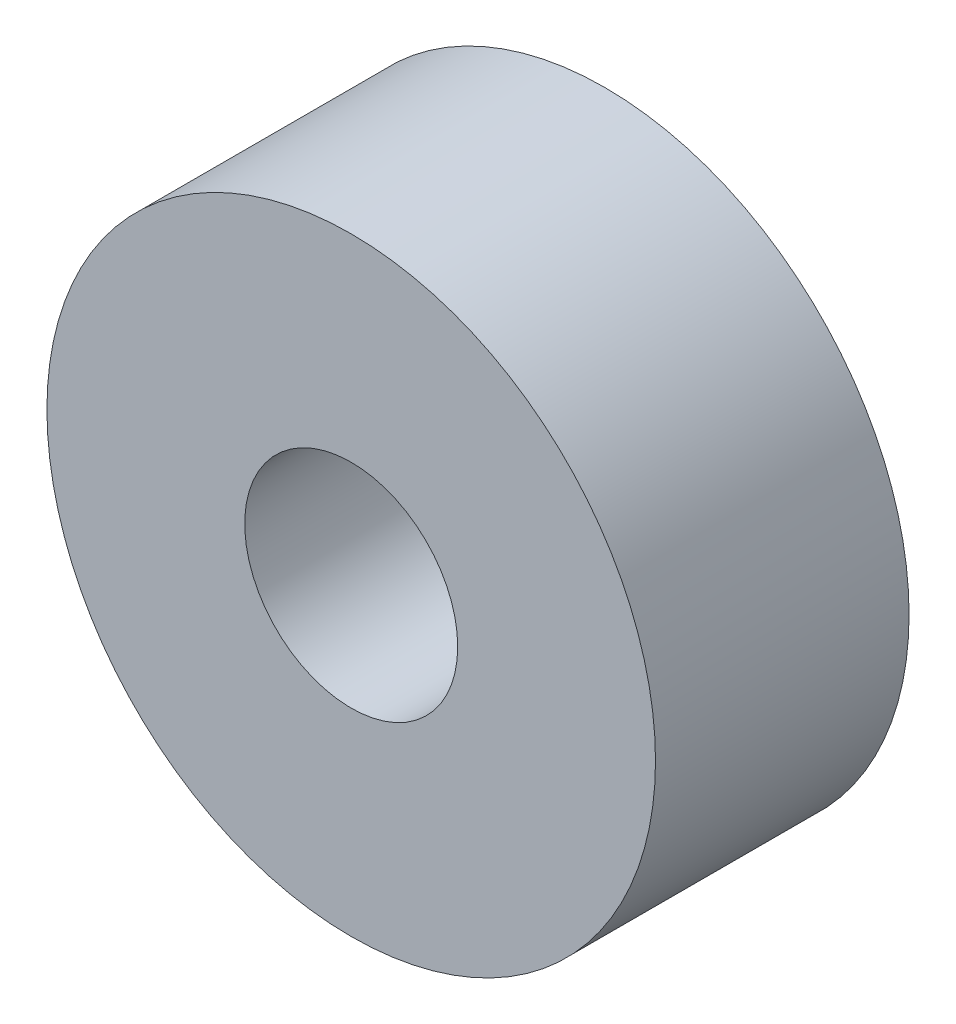
ISO-10303-21;
HEADER;
FILE_DESCRIPTION(('STEP AP214'),'2;1');
FILE_NAME('part.step','',(''),(''),'','','');
FILE_SCHEMA(('AUTOMOTIVE_DESIGN { 1 0 10303 214 1 1 1 1 }'));
ENDSEC;
DATA;
#1=APPLICATION_CONTEXT('core data for automotive mechanical design processes');
#2=APPLICATION_PROTOCOL_DEFINITION('international standard','automotive_design',2000,#1);
#3=PRODUCT_CONTEXT('',#1,'mechanical');
#4=PRODUCT('Part','Part','',(#3));
#5=PRODUCT_RELATED_PRODUCT_CATEGORY('part','',(#4));
#6=PRODUCT_DEFINITION_FORMATION('','',#4);
#7=PRODUCT_DEFINITION_CONTEXT('part definition',#1,'design');
#8=PRODUCT_DEFINITION('design','',#6,#7);
#9=PRODUCT_DEFINITION_SHAPE('','',#8);
#10=(LENGTH_UNIT() NAMED_UNIT(*) SI_UNIT(.MILLI.,.METRE.));
#11=(NAMED_UNIT(*) PLANE_ANGLE_UNIT() SI_UNIT($,.RADIAN.));
#12=(NAMED_UNIT(*) SI_UNIT($,.STERADIAN.) SOLID_ANGLE_UNIT());
#13=UNCERTAINTY_MEASURE_WITH_UNIT(LENGTH_MEASURE(1.E-05),#10,'distance_accuracy_value','');
#14=(GEOMETRIC_REPRESENTATION_CONTEXT(3) GLOBAL_UNCERTAINTY_ASSIGNED_CONTEXT((#13)) GLOBAL_UNIT_ASSIGNED_CONTEXT((#10,
#11,#12)) REPRESENTATION_CONTEXT('',''));
#15=CARTESIAN_POINT('',(0.,0.,0.));
#16=DIRECTION('',(0.,0.,1.));
#17=DIRECTION('',(1.,0.,0.));
#18=AXIS2_PLACEMENT_3D('',#15,#16,#17);
#19=CARTESIAN_POINT('',(0.,0.,5.));
#20=DIRECTION('',(0.,0.,1.));
#21=DIRECTION('',(1.,0.,0.));
#22=AXIS2_PLACEMENT_3D('',#19,#20,#21);
#23=PLANE('',#22);
#24=CARTESIAN_POINT('',(0.,0.,5.));
#25=DIRECTION('',(0.,0.,1.));
#26=DIRECTION('',(1.,0.,0.));
#27=AXIS2_PLACEMENT_3D('',#24,#25,#26);
#28=CIRCLE('',#27,6.);
#29=CARTESIAN_POINT('',(6.,0.,5.));
#30=VERTEX_POINT('',#29);
#31=EDGE_CURVE('E10',#30,#30,#28,.T.);
#32=ORIENTED_EDGE('',*,*,#31,.T.);
#33=EDGE_LOOP('',(#32));
#34=FACE_BOUND('',#33,.T.);
#35=CARTESIAN_POINT('',(0.,0.,5.));
#36=DIRECTION('',(0.,0.,1.));
#37=DIRECTION('',(1.,0.,0.));
#38=AXIS2_PLACEMENT_3D('',#35,#36,#37);
#39=CIRCLE('',#38,2.1);
#40=CARTESIAN_POINT('',(2.1,0.,5.));
#41=VERTEX_POINT('',#40);
#42=EDGE_CURVE('E41',#41,#41,#39,.T.);
#43=ORIENTED_EDGE('',*,*,#42,.F.);
#44=EDGE_LOOP('',(#43));
#45=FACE_BOUND('',#44,.T.);
#46=ADVANCED_FACE('F30',(#34,#45),#23,.T.);
#47=CARTESIAN_POINT('',(0.,0.,0.));
#48=DIRECTION('',(0.,0.,1.));
#49=DIRECTION('',(1.,0.,0.));
#50=AXIS2_PLACEMENT_3D('',#47,#48,#49);
#51=PLANE('',#50);
#52=CARTESIAN_POINT('',(0.,0.,0.));
#53=DIRECTION('',(0.,0.,1.));
#54=DIRECTION('',(1.,0.,0.));
#55=AXIS2_PLACEMENT_3D('',#52,#53,#54);
#56=CIRCLE('',#55,6.);
#57=CARTESIAN_POINT('',(6.,0.,0.));
#58=VERTEX_POINT('',#57);
#59=EDGE_CURVE('E34',#58,#58,#56,.T.);
#60=ORIENTED_EDGE('',*,*,#59,.F.);
#61=EDGE_LOOP('',(#60));
#62=FACE_BOUND('',#61,.T.);
#63=CARTESIAN_POINT('',(0.,0.,0.));
#64=DIRECTION('',(0.,0.,1.));
#65=DIRECTION('',(1.,0.,0.));
#66=AXIS2_PLACEMENT_3D('',#63,#64,#65);
#67=CIRCLE('',#66,2.1);
#68=CARTESIAN_POINT('',(2.1,0.,0.));
#69=VERTEX_POINT('',#68);
#70=EDGE_CURVE('E43',#69,#69,#67,.T.);
#71=ORIENTED_EDGE('',*,*,#70,.T.);
#72=EDGE_LOOP('',(#71));
#73=FACE_BOUND('',#72,.T.);
#74=ADVANCED_FACE('F53',(#62,#73),#51,.F.);
#75=CARTESIAN_POINT('',(0.,0.,5.));
#76=DIRECTION('',(0.,0.,-1.));
#77=DIRECTION('',(-1.,0.,0.));
#78=AXIS2_PLACEMENT_3D('',#75,#76,#77);
#79=CYLINDRICAL_SURFACE('',#78,6.);
#80=ORIENTED_EDGE('',*,*,#31,.F.);
#81=EDGE_LOOP('',(#80));
#82=FACE_BOUND('',#81,.T.);
#83=ORIENTED_EDGE('',*,*,#59,.T.);
#84=EDGE_LOOP('',(#83));
#85=FACE_BOUND('',#84,.T.);
#86=ADVANCED_FACE('F32',(#82,#85),#79,.T.);
#87=CARTESIAN_POINT('',(0.,0.,5.));
#88=DIRECTION('',(0.,0.,-1.));
#89=DIRECTION('',(-1.,0.,0.));
#90=AXIS2_PLACEMENT_3D('',#87,#88,#89);
#91=CYLINDRICAL_SURFACE('',#90,2.1);
#92=ORIENTED_EDGE('',*,*,#42,.T.);
#93=EDGE_LOOP('',(#92));
#94=FACE_BOUND('',#93,.T.);
#95=ORIENTED_EDGE('',*,*,#70,.F.);
#96=EDGE_LOOP('',(#95));
#97=FACE_BOUND('',#96,.T.);
#98=ADVANCED_FACE('F49',(#94,#97),#91,.F.);
#99=CLOSED_SHELL('',(#46,#74,#86,#98));
#100=MANIFOLD_SOLID_BREP('B2',#99);
#101=ADVANCED_BREP_SHAPE_REPRESENTATION('',(#18,#100),#14);
#102=SHAPE_DEFINITION_REPRESENTATION(#9,#101);
ENDSEC;
END-ISO-10303-21;
